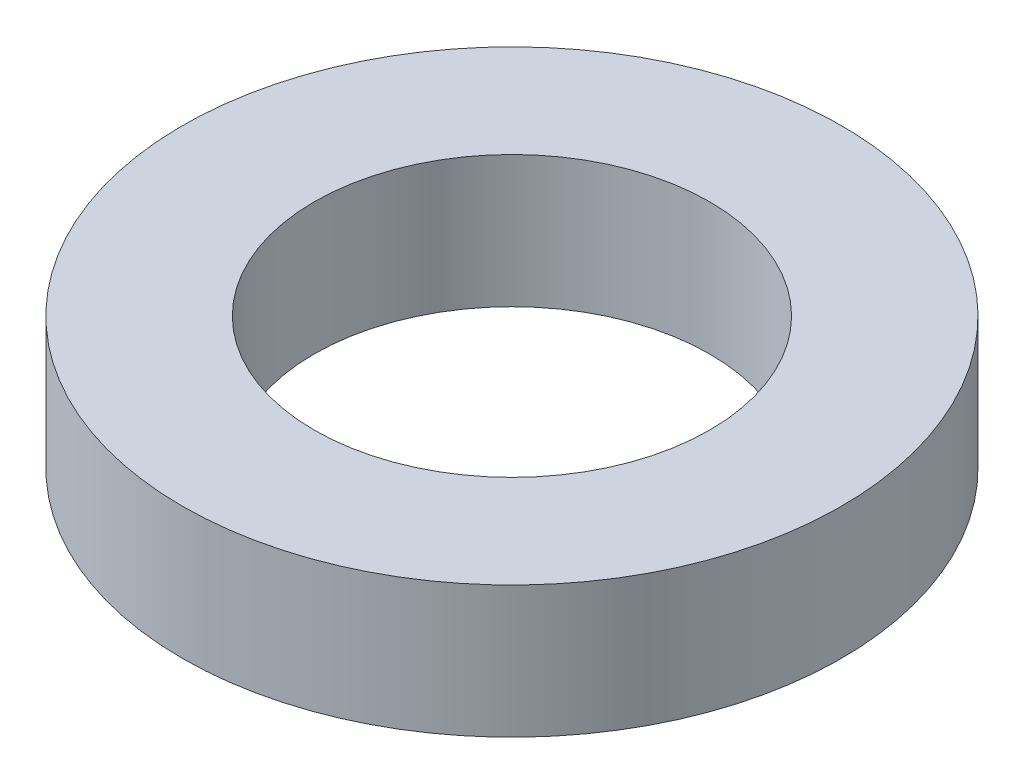
ISO-10303-21;
HEADER;
FILE_DESCRIPTION(('STEP AP214'),'2;1');
FILE_NAME('part.step','',(''),(''),'','','');
FILE_SCHEMA(('AUTOMOTIVE_DESIGN { 1 0 10303 214 1 1 1 1 }'));
ENDSEC;
DATA;
#1=APPLICATION_CONTEXT('core data for automotive mechanical design processes');
#2=APPLICATION_PROTOCOL_DEFINITION('international standard','automotive_design',2000,#1);
#3=PRODUCT_CONTEXT('',#1,'mechanical');
#4=PRODUCT('Part','Part','',(#3));
#5=PRODUCT_RELATED_PRODUCT_CATEGORY('part','',(#4));
#6=PRODUCT_DEFINITION_FORMATION('','',#4);
#7=PRODUCT_DEFINITION_CONTEXT('part definition',#1,'design');
#8=PRODUCT_DEFINITION('design','',#6,#7);
#9=PRODUCT_DEFINITION_SHAPE('','',#8);
#10=(LENGTH_UNIT() NAMED_UNIT(*) SI_UNIT(.MILLI.,.METRE.));
#11=(NAMED_UNIT(*) PLANE_ANGLE_UNIT() SI_UNIT($,.RADIAN.));
#12=(NAMED_UNIT(*) SI_UNIT($,.STERADIAN.) SOLID_ANGLE_UNIT());
#13=UNCERTAINTY_MEASURE_WITH_UNIT(LENGTH_MEASURE(1.E-05),#10,'distance_accuracy_value','');
#14=(GEOMETRIC_REPRESENTATION_CONTEXT(3) GLOBAL_UNCERTAINTY_ASSIGNED_CONTEXT((#13)) GLOBAL_UNIT_ASSIGNED_CONTEXT((#10,
#11,#12)) REPRESENTATION_CONTEXT('',''));
#15=CARTESIAN_POINT('',(0.,0.,0.));
#16=DIRECTION('',(0.,0.,1.));
#17=DIRECTION('',(1.,0.,0.));
#18=AXIS2_PLACEMENT_3D('',#15,#16,#17);
#19=CARTESIAN_POINT('',(0.,10.,0.));
#20=DIRECTION('',(0.,-1.,0.));
#21=DIRECTION('',(0.,0.,-1.));
#22=AXIS2_PLACEMENT_3D('',#19,#20,#21);
#23=CYLINDRICAL_SURFACE('',#22,25.);
#24=CARTESIAN_POINT('',(0.,10.,0.));
#25=DIRECTION('',(0.,1.,0.));
#26=DIRECTION('',(0.,0.,1.));
#27=AXIS2_PLACEMENT_3D('',#24,#25,#26);
#28=CIRCLE('',#27,25.);
#29=CARTESIAN_POINT('',(0.,10.,25.));
#30=VERTEX_POINT('',#29);
#31=EDGE_CURVE('E10',#30,#30,#28,.T.);
#32=ORIENTED_EDGE('',*,*,#31,.F.);
#33=EDGE_LOOP('',(#32));
#34=FACE_BOUND('',#33,.T.);
#35=CARTESIAN_POINT('',(0.,0.,0.));
#36=DIRECTION('',(0.,1.,0.));
#37=DIRECTION('',(0.,0.,1.));
#38=AXIS2_PLACEMENT_3D('',#35,#36,#37);
#39=CIRCLE('',#38,25.);
#40=CARTESIAN_POINT('',(0.,0.,25.));
#41=VERTEX_POINT('',#40);
#42=EDGE_CURVE('E36',#41,#41,#39,.T.);
#43=ORIENTED_EDGE('',*,*,#42,.T.);
#44=EDGE_LOOP('',(#43));
#45=FACE_BOUND('',#44,.T.);
#46=ADVANCED_FACE('F33',(#34,#45),#23,.T.);
#47=CARTESIAN_POINT('',(0.,10.,0.));
#48=DIRECTION('',(0.,1.,0.));
#49=DIRECTION('',(0.,0.,1.));
#50=AXIS2_PLACEMENT_3D('',#47,#48,#49);
#51=PLANE('',#50);
#52=CARTESIAN_POINT('',(0.,10.,0.));
#53=DIRECTION('',(0.,1.,0.));
#54=DIRECTION('',(0.,0.,1.));
#55=AXIS2_PLACEMENT_3D('',#52,#53,#54);
#56=CIRCLE('',#55,15.);
#57=CARTESIAN_POINT('',(0.,10.,15.));
#58=VERTEX_POINT('',#57);
#59=EDGE_CURVE('E43',#58,#58,#56,.T.);
#60=ORIENTED_EDGE('',*,*,#59,.F.);
#61=EDGE_LOOP('',(#60));
#62=FACE_BOUND('',#61,.T.);
#63=ORIENTED_EDGE('',*,*,#31,.T.);
#64=EDGE_LOOP('',(#63));
#65=FACE_BOUND('',#64,.T.);
#66=ADVANCED_FACE('F54',(#62,#65),#51,.T.);
#67=CARTESIAN_POINT('',(0.,0.,0.));
#68=DIRECTION('',(0.,1.,0.));
#69=DIRECTION('',(0.,0.,1.));
#70=AXIS2_PLACEMENT_3D('',#67,#68,#69);
#71=PLANE('',#70);
#72=CARTESIAN_POINT('',(0.,0.,0.));
#73=DIRECTION('',(0.,1.,0.));
#74=DIRECTION('',(0.,0.,1.));
#75=AXIS2_PLACEMENT_3D('',#72,#73,#74);
#76=CIRCLE('',#75,15.);
#77=CARTESIAN_POINT('',(0.,0.,15.));
#78=VERTEX_POINT('',#77);
#79=EDGE_CURVE('E45',#78,#78,#76,.T.);
#80=ORIENTED_EDGE('',*,*,#79,.T.);
#81=EDGE_LOOP('',(#80));
#82=FACE_BOUND('',#81,.T.);
#83=ORIENTED_EDGE('',*,*,#42,.F.);
#84=EDGE_LOOP('',(#83));
#85=FACE_BOUND('',#84,.T.);
#86=ADVANCED_FACE('F56',(#82,#85),#71,.F.);
#87=CARTESIAN_POINT('',(0.,10.,0.));
#88=DIRECTION('',(0.,-1.,0.));
#89=DIRECTION('',(0.,0.,-1.));
#90=AXIS2_PLACEMENT_3D('',#87,#88,#89);
#91=CYLINDRICAL_SURFACE('',#90,15.);
#92=ORIENTED_EDGE('',*,*,#59,.T.);
#93=EDGE_LOOP('',(#92));
#94=FACE_BOUND('',#93,.T.);
#95=ORIENTED_EDGE('',*,*,#79,.F.);
#96=EDGE_LOOP('',(#95));
#97=FACE_BOUND('',#96,.T.);
#98=ADVANCED_FACE('F51',(#94,#97),#91,.F.);
#99=CLOSED_SHELL('',(#46,#66,#86,#98));
#100=MANIFOLD_SOLID_BREP('B2',#99);
#101=ADVANCED_BREP_SHAPE_REPRESENTATION('',(#18,#100),#14);
#102=SHAPE_DEFINITION_REPRESENTATION(#9,#101);
ENDSEC;
END-ISO-10303-21;
